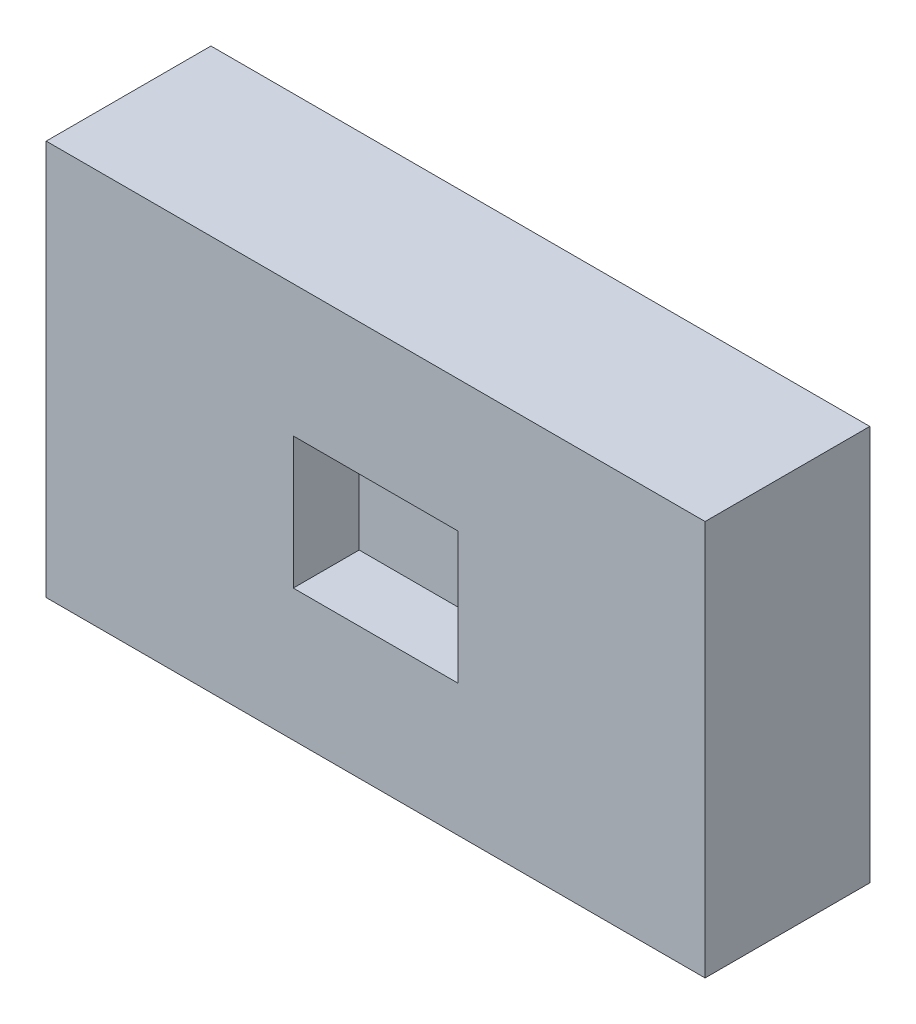
ISO-10303-21;
HEADER;
FILE_DESCRIPTION(('STEP AP214'),'2;1');
FILE_NAME('part.step','',(''),(''),'','','');
FILE_SCHEMA(('AUTOMOTIVE_DESIGN { 1 0 10303 214 1 1 1 1 }'));
ENDSEC;
DATA;
#1=APPLICATION_CONTEXT('core data for automotive mechanical design processes');
#2=APPLICATION_PROTOCOL_DEFINITION('international standard','automotive_design',2000,#1);
#3=PRODUCT_CONTEXT('',#1,'mechanical');
#4=PRODUCT('Part','Part','',(#3));
#5=PRODUCT_RELATED_PRODUCT_CATEGORY('part','',(#4));
#6=PRODUCT_DEFINITION_FORMATION('','',#4);
#7=PRODUCT_DEFINITION_CONTEXT('part definition',#1,'design');
#8=PRODUCT_DEFINITION('design','',#6,#7);
#9=PRODUCT_DEFINITION_SHAPE('','',#8);
#10=(LENGTH_UNIT() NAMED_UNIT(*) SI_UNIT(.MILLI.,.METRE.));
#11=(NAMED_UNIT(*) PLANE_ANGLE_UNIT() SI_UNIT($,.RADIAN.));
#12=(NAMED_UNIT(*) SI_UNIT($,.STERADIAN.) SOLID_ANGLE_UNIT());
#13=UNCERTAINTY_MEASURE_WITH_UNIT(LENGTH_MEASURE(1.E-05),#10,'distance_accuracy_value','');
#14=(GEOMETRIC_REPRESENTATION_CONTEXT(3) GLOBAL_UNCERTAINTY_ASSIGNED_CONTEXT((#13)) GLOBAL_UNIT_ASSIGNED_CONTEXT((#10,
#11,#12)) REPRESENTATION_CONTEXT('',''));
#15=CARTESIAN_POINT('',(0.,0.,0.));
#16=DIRECTION('',(0.,0.,1.));
#17=DIRECTION('',(1.,0.,0.));
#18=AXIS2_PLACEMENT_3D('',#15,#16,#17);
#19=CARTESIAN_POINT('',(0.,0.,10.));
#20=DIRECTION('',(1.,0.,0.));
#21=DIRECTION('',(0.,0.,-1.));
#22=AXIS2_PLACEMENT_3D('',#19,#20,#21);
#23=PLANE('',#22);
#24=DIRECTION('',(0.,-1.,0.));
#25=VECTOR('',#24,1.);
#26=CARTESIAN_POINT('',(0.,0.,0.));
#27=LINE('',#26,#25);
#28=CARTESIAN_POINT('',(0.,24.,0.));
#29=VERTEX_POINT('',#28);
#30=CARTESIAN_POINT('',(0.,0.,0.));
#31=VERTEX_POINT('',#30);
#32=EDGE_CURVE('E153',#29,#31,#27,.T.);
#33=ORIENTED_EDGE('',*,*,#32,.T.);
#34=DIRECTION('',(0.,0.,-1.));
#35=VECTOR('',#34,1.);
#36=CARTESIAN_POINT('',(0.,0.,10.));
#37=LINE('',#36,#35);
#38=CARTESIAN_POINT('',(0.,0.,10.));
#39=VERTEX_POINT('',#38);
#40=EDGE_CURVE('E11',#39,#31,#37,.T.);
#41=ORIENTED_EDGE('',*,*,#40,.F.);
#42=DIRECTION('',(0.,-1.,0.));
#43=VECTOR('',#42,1.);
#44=CARTESIAN_POINT('',(0.,0.,10.));
#45=LINE('',#44,#43);
#46=CARTESIAN_POINT('',(0.,24.,10.));
#47=VERTEX_POINT('',#46);
#48=EDGE_CURVE('E160',#47,#39,#45,.T.);
#49=ORIENTED_EDGE('',*,*,#48,.F.);
#50=DIRECTION('',(0.,0.,-1.));
#51=VECTOR('',#50,1.);
#52=CARTESIAN_POINT('',(0.,24.,10.));
#53=LINE('',#52,#51);
#54=EDGE_CURVE('E162',#47,#29,#53,.T.);
#55=ORIENTED_EDGE('',*,*,#54,.T.);
#56=EDGE_LOOP('',(#33,#41,#49,#55));
#57=FACE_BOUND('',#56,.T.);
#58=ADVANCED_FACE('F44',(#57),#23,.F.);
#59=CARTESIAN_POINT('',(0.,0.,10.));
#60=DIRECTION('',(0.,1.,0.));
#61=DIRECTION('',(0.,0.,1.));
#62=AXIS2_PLACEMENT_3D('',#59,#60,#61);
#63=PLANE('',#62);
#64=DIRECTION('',(1.,0.,0.));
#65=VECTOR('',#64,1.);
#66=CARTESIAN_POINT('',(0.,0.,0.));
#67=LINE('',#66,#65);
#68=CARTESIAN_POINT('',(40.,0.,0.));
#69=VERTEX_POINT('',#68);
#70=EDGE_CURVE('E167',#31,#69,#67,.T.);
#71=ORIENTED_EDGE('',*,*,#70,.T.);
#72=DIRECTION('',(0.,0.,-1.));
#73=VECTOR('',#72,1.);
#74=CARTESIAN_POINT('',(40.,0.,10.));
#75=LINE('',#74,#73);
#76=CARTESIAN_POINT('',(40.,0.,10.));
#77=VERTEX_POINT('',#76);
#78=EDGE_CURVE('E55',#77,#69,#75,.T.);
#79=ORIENTED_EDGE('',*,*,#78,.F.);
#80=DIRECTION('',(1.,0.,0.));
#81=VECTOR('',#80,1.);
#82=CARTESIAN_POINT('',(0.,0.,10.));
#83=LINE('',#82,#81);
#84=EDGE_CURVE('E96',#39,#77,#83,.T.);
#85=ORIENTED_EDGE('',*,*,#84,.F.);
#86=ORIENTED_EDGE('',*,*,#40,.T.);
#87=EDGE_LOOP('',(#71,#79,#85,#86));
#88=FACE_BOUND('',#87,.T.);
#89=ADVANCED_FACE('F198',(#88),#63,.F.);
#90=CARTESIAN_POINT('',(40.,0.,10.));
#91=DIRECTION('',(-1.,0.,0.));
#92=DIRECTION('',(0.,0.,1.));
#93=AXIS2_PLACEMENT_3D('',#90,#91,#92);
#94=PLANE('',#93);
#95=DIRECTION('',(0.,1.,0.));
#96=VECTOR('',#95,1.);
#97=CARTESIAN_POINT('',(40.,0.,0.));
#98=LINE('',#97,#96);
#99=CARTESIAN_POINT('',(40.,24.,0.));
#100=VERTEX_POINT('',#99);
#101=EDGE_CURVE('E169',#69,#100,#98,.T.);
#102=ORIENTED_EDGE('',*,*,#101,.T.);
#103=DIRECTION('',(0.,0.,-1.));
#104=VECTOR('',#103,1.);
#105=CARTESIAN_POINT('',(40.,24.,10.));
#106=LINE('',#105,#104);
#107=CARTESIAN_POINT('',(40.,24.,10.));
#108=VERTEX_POINT('',#107);
#109=EDGE_CURVE('E175',#108,#100,#106,.T.);
#110=ORIENTED_EDGE('',*,*,#109,.F.);
#111=DIRECTION('',(0.,1.,0.));
#112=VECTOR('',#111,1.);
#113=CARTESIAN_POINT('',(40.,0.,10.));
#114=LINE('',#113,#112);
#115=EDGE_CURVE('E159',#77,#108,#114,.T.);
#116=ORIENTED_EDGE('',*,*,#115,.F.);
#117=ORIENTED_EDGE('',*,*,#78,.T.);
#118=EDGE_LOOP('',(#102,#110,#116,#117));
#119=FACE_BOUND('',#118,.T.);
#120=ADVANCED_FACE('F177',(#119),#94,.F.);
#121=CARTESIAN_POINT('',(0.,24.,10.));
#122=DIRECTION('',(0.,-1.,0.));
#123=DIRECTION('',(0.,0.,-1.));
#124=AXIS2_PLACEMENT_3D('',#121,#122,#123);
#125=PLANE('',#124);
#126=DIRECTION('',(-1.,0.,0.));
#127=VECTOR('',#126,1.);
#128=CARTESIAN_POINT('',(0.,24.,0.));
#129=LINE('',#128,#127);
#130=EDGE_CURVE('E90',#100,#29,#129,.T.);
#131=ORIENTED_EDGE('',*,*,#130,.T.);
#132=ORIENTED_EDGE('',*,*,#54,.F.);
#133=DIRECTION('',(-1.,0.,0.));
#134=VECTOR('',#133,1.);
#135=CARTESIAN_POINT('',(0.,24.,10.));
#136=LINE('',#135,#134);
#137=EDGE_CURVE('E69',#108,#47,#136,.T.);
#138=ORIENTED_EDGE('',*,*,#137,.F.);
#139=ORIENTED_EDGE('',*,*,#109,.T.);
#140=EDGE_LOOP('',(#131,#132,#138,#139));
#141=FACE_BOUND('',#140,.T.);
#142=ADVANCED_FACE('F183',(#141),#125,.F.);
#143=CARTESIAN_POINT('',(0.,0.,10.));
#144=DIRECTION('',(0.,0.,-1.));
#145=DIRECTION('',(-1.,0.,0.));
#146=AXIS2_PLACEMENT_3D('',#143,#144,#145);
#147=PLANE('',#146);
#148=DIRECTION('',(1.,0.,0.));
#149=VECTOR('',#148,1.);
#150=CARTESIAN_POINT('',(15.,8.,10.));
#151=LINE('',#150,#149);
#152=CARTESIAN_POINT('',(15.,8.,10.));
#153=VERTEX_POINT('',#152);
#154=CARTESIAN_POINT('',(25.,8.,10.));
#155=VERTEX_POINT('',#154);
#156=EDGE_CURVE('E150',#153,#155,#151,.T.);
#157=ORIENTED_EDGE('',*,*,#156,.F.);
#158=DIRECTION('',(0.,-1.,0.));
#159=VECTOR('',#158,1.);
#160=CARTESIAN_POINT('',(15.,8.,10.));
#161=LINE('',#160,#159);
#162=CARTESIAN_POINT('',(15.,16.,10.));
#163=VERTEX_POINT('',#162);
#164=EDGE_CURVE('E56',#163,#153,#161,.T.);
#165=ORIENTED_EDGE('',*,*,#164,.F.);
#166=DIRECTION('',(-1.,0.,0.));
#167=VECTOR('',#166,1.);
#168=CARTESIAN_POINT('',(15.,16.,10.));
#169=LINE('',#168,#167);
#170=CARTESIAN_POINT('',(25.,16.,10.));
#171=VERTEX_POINT('',#170);
#172=EDGE_CURVE('E139',#171,#163,#169,.T.);
#173=ORIENTED_EDGE('',*,*,#172,.F.);
#174=DIRECTION('',(0.,1.,0.));
#175=VECTOR('',#174,1.);
#176=CARTESIAN_POINT('',(25.,8.,10.));
#177=LINE('',#176,#175);
#178=EDGE_CURVE('E143',#155,#171,#177,.T.);
#179=ORIENTED_EDGE('',*,*,#178,.F.);
#180=EDGE_LOOP('',(#157,#165,#173,#179));
#181=FACE_BOUND('',#180,.T.);
#182=ORIENTED_EDGE('',*,*,#48,.T.);
#183=ORIENTED_EDGE('',*,*,#84,.T.);
#184=ORIENTED_EDGE('',*,*,#115,.T.);
#185=ORIENTED_EDGE('',*,*,#137,.T.);
#186=EDGE_LOOP('',(#182,#183,#184,#185));
#187=FACE_BOUND('',#186,.T.);
#188=ADVANCED_FACE('F190',(#181,#187),#147,.F.);
#189=CARTESIAN_POINT('',(0.,0.,0.));
#190=DIRECTION('',(0.,0.,-1.));
#191=DIRECTION('',(-1.,0.,0.));
#192=AXIS2_PLACEMENT_3D('',#189,#190,#191);
#193=PLANE('',#192);
#194=ORIENTED_EDGE('',*,*,#32,.F.);
#195=ORIENTED_EDGE('',*,*,#130,.F.);
#196=ORIENTED_EDGE('',*,*,#101,.F.);
#197=ORIENTED_EDGE('',*,*,#70,.F.);
#198=EDGE_LOOP('',(#194,#195,#196,#197));
#199=FACE_BOUND('',#198,.T.);
#200=ADVANCED_FACE('F182',(#199),#193,.T.);
#201=CARTESIAN_POINT('',(15.,8.,6.));
#202=DIRECTION('',(-1.,0.,0.));
#203=DIRECTION('',(0.,0.,1.));
#204=AXIS2_PLACEMENT_3D('',#201,#202,#203);
#205=PLANE('',#204);
#206=ORIENTED_EDGE('',*,*,#164,.T.);
#207=DIRECTION('',(0.,0.,1.));
#208=VECTOR('',#207,1.);
#209=CARTESIAN_POINT('',(15.,8.,6.));
#210=LINE('',#209,#208);
#211=CARTESIAN_POINT('',(15.,8.,6.));
#212=VERTEX_POINT('',#211);
#213=EDGE_CURVE('E116',#212,#153,#210,.T.);
#214=ORIENTED_EDGE('',*,*,#213,.F.);
#215=DIRECTION('',(0.,-1.,0.));
#216=VECTOR('',#215,1.);
#217=CARTESIAN_POINT('',(15.,8.,6.));
#218=LINE('',#217,#216);
#219=CARTESIAN_POINT('',(15.,16.,6.));
#220=VERTEX_POINT('',#219);
#221=EDGE_CURVE('E119',#220,#212,#218,.T.);
#222=ORIENTED_EDGE('',*,*,#221,.F.);
#223=DIRECTION('',(0.,0.,1.));
#224=VECTOR('',#223,1.);
#225=CARTESIAN_POINT('',(15.,16.,6.));
#226=LINE('',#225,#224);
#227=EDGE_CURVE('E151',#220,#163,#226,.T.);
#228=ORIENTED_EDGE('',*,*,#227,.T.);
#229=EDGE_LOOP('',(#206,#214,#222,#228));
#230=FACE_BOUND('',#229,.T.);
#231=ADVANCED_FACE('F117',(#230),#205,.F.);
#232=CARTESIAN_POINT('',(15.,16.,6.));
#233=DIRECTION('',(0.,1.,0.));
#234=DIRECTION('',(0.,0.,1.));
#235=AXIS2_PLACEMENT_3D('',#232,#233,#234);
#236=PLANE('',#235);
#237=ORIENTED_EDGE('',*,*,#172,.T.);
#238=ORIENTED_EDGE('',*,*,#227,.F.);
#239=DIRECTION('',(-1.,0.,0.));
#240=VECTOR('',#239,1.);
#241=CARTESIAN_POINT('',(15.,16.,6.));
#242=LINE('',#241,#240);
#243=CARTESIAN_POINT('',(25.,16.,6.));
#244=VERTEX_POINT('',#243);
#245=EDGE_CURVE('E127',#244,#220,#242,.T.);
#246=ORIENTED_EDGE('',*,*,#245,.F.);
#247=DIRECTION('',(0.,0.,1.));
#248=VECTOR('',#247,1.);
#249=CARTESIAN_POINT('',(25.,16.,6.));
#250=LINE('',#249,#248);
#251=EDGE_CURVE('E152',#244,#171,#250,.T.);
#252=ORIENTED_EDGE('',*,*,#251,.T.);
#253=EDGE_LOOP('',(#237,#238,#246,#252));
#254=FACE_BOUND('',#253,.T.);
#255=ADVANCED_FACE('F240',(#254),#236,.F.);
#256=CARTESIAN_POINT('',(25.,8.,6.));
#257=DIRECTION('',(1.,0.,0.));
#258=DIRECTION('',(0.,0.,-1.));
#259=AXIS2_PLACEMENT_3D('',#256,#257,#258);
#260=PLANE('',#259);
#261=ORIENTED_EDGE('',*,*,#178,.T.);
#262=ORIENTED_EDGE('',*,*,#251,.F.);
#263=DIRECTION('',(0.,1.,0.));
#264=VECTOR('',#263,1.);
#265=CARTESIAN_POINT('',(25.,8.,6.));
#266=LINE('',#265,#264);
#267=CARTESIAN_POINT('',(25.,8.,6.));
#268=VERTEX_POINT('',#267);
#269=EDGE_CURVE('E133',#268,#244,#266,.T.);
#270=ORIENTED_EDGE('',*,*,#269,.F.);
#271=DIRECTION('',(0.,0.,1.));
#272=VECTOR('',#271,1.);
#273=CARTESIAN_POINT('',(25.,8.,6.));
#274=LINE('',#273,#272);
#275=EDGE_CURVE('E125',#268,#155,#274,.T.);
#276=ORIENTED_EDGE('',*,*,#275,.T.);
#277=EDGE_LOOP('',(#261,#262,#270,#276));
#278=FACE_BOUND('',#277,.T.);
#279=ADVANCED_FACE('F246',(#278),#260,.F.);
#280=CARTESIAN_POINT('',(15.,8.,6.));
#281=DIRECTION('',(0.,-1.,0.));
#282=DIRECTION('',(0.,0.,-1.));
#283=AXIS2_PLACEMENT_3D('',#280,#281,#282);
#284=PLANE('',#283);
#285=ORIENTED_EDGE('',*,*,#156,.T.);
#286=ORIENTED_EDGE('',*,*,#275,.F.);
#287=DIRECTION('',(1.,0.,0.));
#288=VECTOR('',#287,1.);
#289=CARTESIAN_POINT('',(15.,8.,6.));
#290=LINE('',#289,#288);
#291=EDGE_CURVE('E129',#212,#268,#290,.T.);
#292=ORIENTED_EDGE('',*,*,#291,.F.);
#293=ORIENTED_EDGE('',*,*,#213,.T.);
#294=EDGE_LOOP('',(#285,#286,#292,#293));
#295=FACE_BOUND('',#294,.T.);
#296=ADVANCED_FACE('F128',(#295),#284,.F.);
#297=CARTESIAN_POINT('',(0.,0.,6.));
#298=DIRECTION('',(0.,0.,-1.));
#299=DIRECTION('',(-1.,0.,0.));
#300=AXIS2_PLACEMENT_3D('',#297,#298,#299);
#301=PLANE('',#300);
#302=ORIENTED_EDGE('',*,*,#221,.T.);
#303=ORIENTED_EDGE('',*,*,#291,.T.);
#304=ORIENTED_EDGE('',*,*,#269,.T.);
#305=ORIENTED_EDGE('',*,*,#245,.T.);
#306=EDGE_LOOP('',(#302,#303,#304,#305));
#307=FACE_BOUND('',#306,.T.);
#308=ADVANCED_FACE('F136',(#307),#301,.F.);
#309=CLOSED_SHELL('',(#58,#89,#120,#142,#188,#200,#231,#255,#279,#296,#308));
#310=MANIFOLD_SOLID_BREP('B2',#309);
#311=ADVANCED_BREP_SHAPE_REPRESENTATION('',(#18,#310),#14);
#312=SHAPE_DEFINITION_REPRESENTATION(#9,#311);
ENDSEC;
END-ISO-10303-21;
